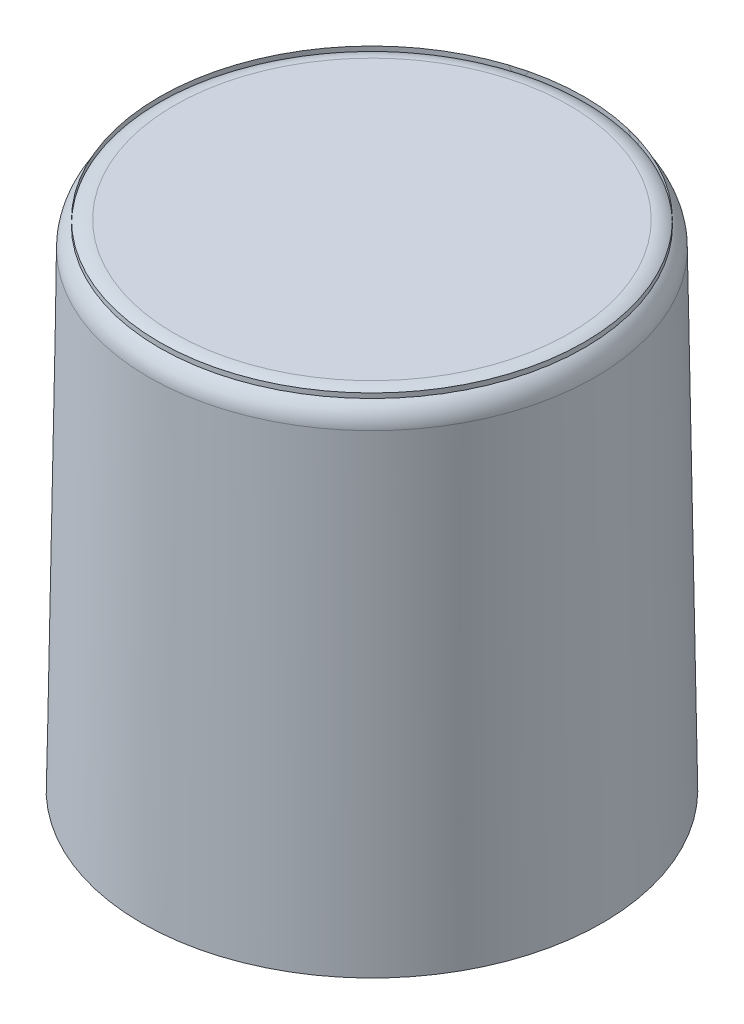
ISO-10303-21;
HEADER;
FILE_DESCRIPTION(('STEP AP214'),'2;1');
FILE_NAME('part.step','',(''),(''),'','','');
FILE_SCHEMA(('AUTOMOTIVE_DESIGN { 1 0 10303 214 1 1 1 1 }'));
ENDSEC;
DATA;
#1=APPLICATION_CONTEXT('core data for automotive mechanical design processes');
#2=APPLICATION_PROTOCOL_DEFINITION('international standard','automotive_design',2000,#1);
#3=PRODUCT_CONTEXT('',#1,'mechanical');
#4=PRODUCT('Part','Part','',(#3));
#5=PRODUCT_RELATED_PRODUCT_CATEGORY('part','',(#4));
#6=PRODUCT_DEFINITION_FORMATION('','',#4);
#7=PRODUCT_DEFINITION_CONTEXT('part definition',#1,'design');
#8=PRODUCT_DEFINITION('design','',#6,#7);
#9=PRODUCT_DEFINITION_SHAPE('','',#8);
#10=(LENGTH_UNIT() NAMED_UNIT(*) SI_UNIT(.MILLI.,.METRE.));
#11=(NAMED_UNIT(*) PLANE_ANGLE_UNIT() SI_UNIT($,.RADIAN.));
#12=(NAMED_UNIT(*) SI_UNIT($,.STERADIAN.) SOLID_ANGLE_UNIT());
#13=UNCERTAINTY_MEASURE_WITH_UNIT(LENGTH_MEASURE(1.E-05),#10,'distance_accuracy_value','');
#14=(GEOMETRIC_REPRESENTATION_CONTEXT(3) GLOBAL_UNCERTAINTY_ASSIGNED_CONTEXT((#13)) GLOBAL_UNIT_ASSIGNED_CONTEXT((#10,
#11,#12)) REPRESENTATION_CONTEXT('',''));
#15=CARTESIAN_POINT('',(0.,0.,0.));
#16=DIRECTION('',(0.,0.,1.));
#17=DIRECTION('',(1.,0.,0.));
#18=AXIS2_PLACEMENT_3D('',#15,#16,#17);
#19=CARTESIAN_POINT('',(0.,96.5,0.));
#20=DIRECTION('',(0.,1.,0.));
#21=DIRECTION('',(0.,0.,1.));
#22=AXIS2_PLACEMENT_3D('',#19,#20,#21);
#23=PLANE('',#22);
#24=CARTESIAN_POINT('',(0.,96.5,0.));
#25=DIRECTION('',(0.,1.,0.));
#26=DIRECTION('',(0.,0.,1.));
#27=AXIS2_PLACEMENT_3D('',#24,#25,#26);
#28=CIRCLE('',#27,38.5771162006747);
#29=CARTESIAN_POINT('',(0.,96.5,38.5771162006747));
#30=VERTEX_POINT('',#29);
#31=EDGE_CURVE('E41',#30,#30,#28,.T.);
#32=ORIENTED_EDGE('',*,*,#31,.T.);
#33=EDGE_LOOP('',(#32));
#34=FACE_BOUND('',#33,.T.);
#35=ADVANCED_FACE('F34',(#34),#23,.T.);
#36=CARTESIAN_POINT('',(0.,0.,0.));
#37=DIRECTION('',(0.,1.,0.));
#38=DIRECTION('',(0.,0.,1.));
#39=AXIS2_PLACEMENT_3D('',#36,#37,#38);
#40=PLANE('',#39);
#41=CARTESIAN_POINT('',(0.,0.,0.));
#42=DIRECTION('',(0.,1.,0.));
#43=DIRECTION('',(0.,0.,1.));
#44=AXIS2_PLACEMENT_3D('',#41,#42,#43);
#45=CIRCLE('',#44,42.9997583973683);
#46=CARTESIAN_POINT('',(0.,0.,42.9997583973683));
#47=VERTEX_POINT('',#46);
#48=EDGE_CURVE('E49',#47,#47,#45,.T.);
#49=ORIENTED_EDGE('',*,*,#48,.T.);
#50=EDGE_LOOP('',(#49));
#51=FACE_BOUND('',#50,.T.);
#52=CARTESIAN_POINT('',(0.,0.,0.));
#53=DIRECTION('',(0.,1.,0.));
#54=DIRECTION('',(0.,0.,1.));
#55=AXIS2_PLACEMENT_3D('',#52,#53,#54);
#56=CIRCLE('',#55,45.);
#57=CARTESIAN_POINT('',(0.,0.,45.));
#58=VERTEX_POINT('',#57);
#59=EDGE_CURVE('E45',#58,#58,#56,.T.);
#60=ORIENTED_EDGE('',*,*,#59,.F.);
#61=EDGE_LOOP('',(#60));
#62=FACE_BOUND('',#61,.T.);
#63=ADVANCED_FACE('F64',(#51,#62),#40,.F.);
#64=CARTESIAN_POINT('',(0.,96.5,0.));
#65=DIRECTION('',(0.,-1.,0.));
#66=DIRECTION('',(0.,0.,-1.));
#67=AXIS2_PLACEMENT_3D('',#64,#65,#66);
#68=CONICAL_SURFACE('',#67,43.5,0.0155427897295163);
#69=CARTESIAN_POINT('',(0.,91.5777108196849,0.));
#70=DIRECTION('',(0.,1.,0.));
#71=DIRECTION('',(0.,0.,1.));
#72=AXIS2_PLACEMENT_3D('',#69,#70,#71);
#73=CIRCLE('',#72,43.5765122670515);
#74=CARTESIAN_POINT('',(0.,91.5777108196849,43.5765122670515));
#75=VERTEX_POINT('',#74);
#76=EDGE_CURVE('E11',#75,#75,#73,.F.);
#77=ORIENTED_EDGE('',*,*,#76,.T.);
#78=EDGE_LOOP('',(#77));
#79=FACE_BOUND('',#78,.T.);
#80=ORIENTED_EDGE('',*,*,#59,.T.);
#81=EDGE_LOOP('',(#80));
#82=FACE_BOUND('',#81,.T.);
#83=ADVANCED_FACE('F74',(#79,#82),#68,.T.);
#84=CARTESIAN_POINT('',(0.,96.4689156721262,0.));
#85=DIRECTION('',(0.,-1.,0.));
#86=DIRECTION('',(0.,0.,-1.));
#87=AXIS2_PLACEMENT_3D('',#84,#85,#86);
#88=CONICAL_SURFACE('',#87,41.5002415734493,0.0155427897295163);
#89=CARTESIAN_POINT('',(0.,96.4844568973627,0.));
#90=DIRECTION('',(0.,-1.,0.));
#91=DIRECTION('',(0.,0.,-1.));
#92=AXIS2_PLACEMENT_3D('',#89,#90,#91);
#93=CIRCLE('',#92,41.5);
#94=CARTESIAN_POINT('',(0.,96.4844568973627,-41.5));
#95=VERTEX_POINT('',#94);
#96=EDGE_CURVE('E52',#95,#95,#93,.F.);
#97=ORIENTED_EDGE('',*,*,#96,.T.);
#98=EDGE_LOOP('',(#97));
#99=FACE_BOUND('',#98,.T.);
#100=ORIENTED_EDGE('',*,*,#48,.F.);
#101=EDGE_LOOP('',(#100));
#102=FACE_BOUND('',#101,.T.);
#103=ADVANCED_FACE('F76',(#99,#102),#88,.F.);
#104=CARTESIAN_POINT('',(0.,94.,0.));
#105=DIRECTION('',(0.,1.,0.));
#106=DIRECTION('',(0.,0.,1.));
#107=AXIS2_PLACEMENT_3D('',#104,#105,#106);
#108=CYLINDRICAL_SURFACE('',#107,41.5);
#109=CARTESIAN_POINT('',(0.,94.,0.));
#110=DIRECTION('',(0.,1.,0.));
#111=DIRECTION('',(0.,0.,1.));
#112=AXIS2_PLACEMENT_3D('',#109,#110,#111);
#113=CIRCLE('',#112,41.5);
#114=CARTESIAN_POINT('',(0.,94.,41.5));
#115=VERTEX_POINT('',#114);
#116=EDGE_CURVE('E55',#115,#115,#113,.T.);
#117=ORIENTED_EDGE('',*,*,#116,.T.);
#118=EDGE_LOOP('',(#117));
#119=FACE_BOUND('',#118,.T.);
#120=ORIENTED_EDGE('',*,*,#96,.F.);
#121=EDGE_LOOP('',(#120));
#122=FACE_BOUND('',#121,.T.);
#123=ADVANCED_FACE('F95',(#119,#122),#108,.T.);
#124=CARTESIAN_POINT('',(0.,94.,0.));
#125=DIRECTION('',(0.,1.,0.));
#126=DIRECTION('',(0.,0.,1.));
#127=AXIS2_PLACEMENT_3D('',#124,#125,#126);
#128=PLANE('',#127);
#129=ORIENTED_EDGE('',*,*,#116,.F.);
#130=EDGE_LOOP('',(#129));
#131=FACE_BOUND('',#130,.T.);
#132=ADVANCED_FACE('F98',(#131),#128,.F.);
#133=CARTESIAN_POINT('',(0.,91.5,0.));
#134=DIRECTION('',(0.,1.,0.));
#135=DIRECTION('',(0.,0.,1.));
#136=AXIS2_PLACEMENT_3D('',#133,#134,#135);
#137=TOROIDAL_SURFACE('',#136,38.5771162006747,5.);
#138=ORIENTED_EDGE('',*,*,#76,.F.);
#139=EDGE_LOOP('',(#138));
#140=FACE_BOUND('',#139,.T.);
#141=ORIENTED_EDGE('',*,*,#31,.F.);
#142=EDGE_LOOP('',(#141));
#143=FACE_BOUND('',#142,.T.);
#144=ADVANCED_FACE('F36',(#140,#143),#137,.T.);
#145=CLOSED_SHELL('',(#35,#63,#83,#103,#123,#132,#144));
#146=MANIFOLD_SOLID_BREP('B2',#145);
#147=ADVANCED_BREP_SHAPE_REPRESENTATION('',(#18,#146),#14);
#148=SHAPE_DEFINITION_REPRESENTATION(#9,#147);
ENDSEC;
END-ISO-10303-21;
